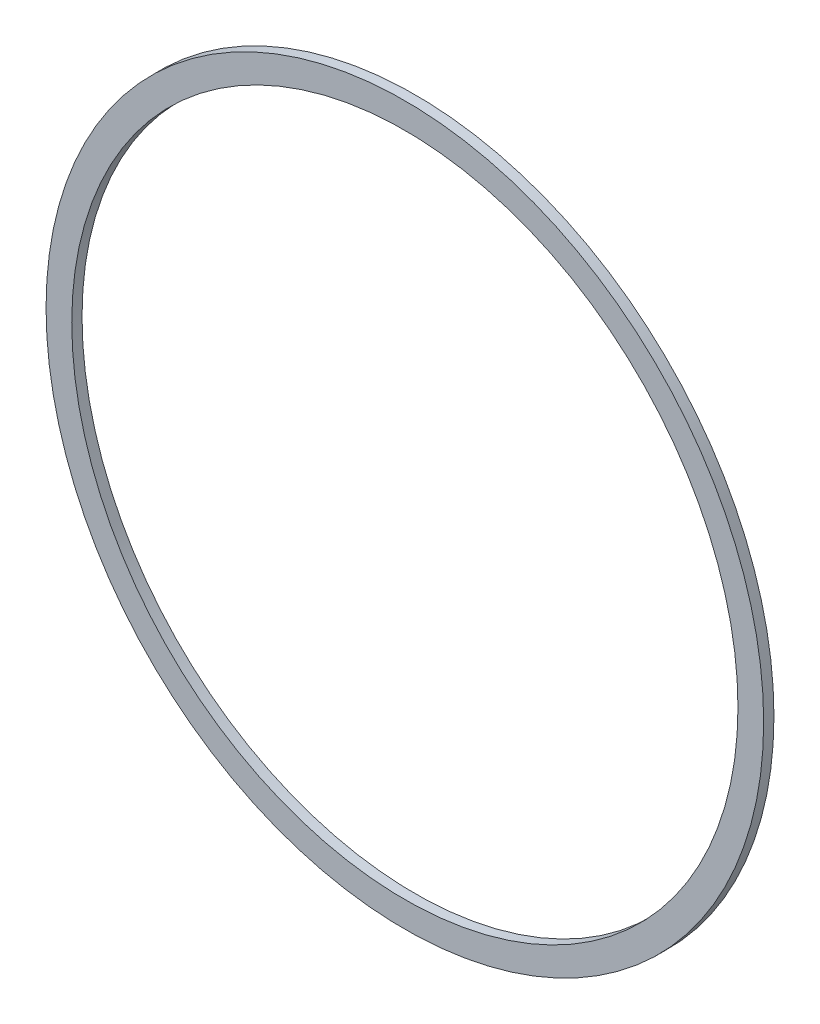
ISO-10303-21;
HEADER;
FILE_DESCRIPTION(('STEP AP214'),'2;1');
FILE_NAME('part.step','',(''),(''),'','','');
FILE_SCHEMA(('AUTOMOTIVE_DESIGN { 1 0 10303 214 1 1 1 1 }'));
ENDSEC;
DATA;
#1=APPLICATION_CONTEXT('core data for automotive mechanical design processes');
#2=APPLICATION_PROTOCOL_DEFINITION('international standard','automotive_design',2000,#1);
#3=PRODUCT_CONTEXT('',#1,'mechanical');
#4=PRODUCT('Part','Part','',(#3));
#5=PRODUCT_RELATED_PRODUCT_CATEGORY('part','',(#4));
#6=PRODUCT_DEFINITION_FORMATION('','',#4);
#7=PRODUCT_DEFINITION_CONTEXT('part definition',#1,'design');
#8=PRODUCT_DEFINITION('design','',#6,#7);
#9=PRODUCT_DEFINITION_SHAPE('','',#8);
#10=(LENGTH_UNIT() NAMED_UNIT(*) SI_UNIT(.MILLI.,.METRE.));
#11=(NAMED_UNIT(*) PLANE_ANGLE_UNIT() SI_UNIT($,.RADIAN.));
#12=(NAMED_UNIT(*) SI_UNIT($,.STERADIAN.) SOLID_ANGLE_UNIT());
#13=UNCERTAINTY_MEASURE_WITH_UNIT(LENGTH_MEASURE(1.E-05),#10,'distance_accuracy_value','');
#14=(GEOMETRIC_REPRESENTATION_CONTEXT(3) GLOBAL_UNCERTAINTY_ASSIGNED_CONTEXT((#13)) GLOBAL_UNIT_ASSIGNED_CONTEXT((#10,
#11,#12)) REPRESENTATION_CONTEXT('',''));
#15=CARTESIAN_POINT('',(0.,0.,0.));
#16=DIRECTION('',(0.,0.,1.));
#17=DIRECTION('',(1.,0.,0.));
#18=AXIS2_PLACEMENT_3D('',#15,#16,#17);
#19=CARTESIAN_POINT('',(0.,0.,2.));
#20=DIRECTION('',(0.,0.,1.));
#21=DIRECTION('',(1.,0.,0.));
#22=AXIS2_PLACEMENT_3D('',#19,#20,#21);
#23=PLANE('',#22);
#24=CARTESIAN_POINT('',(0.,0.,2.));
#25=DIRECTION('',(0.,0.,1.));
#26=DIRECTION('',(1.,0.,0.));
#27=AXIS2_PLACEMENT_3D('',#24,#25,#26);
#28=CIRCLE('',#27,69.8);
#29=CARTESIAN_POINT('',(69.8,0.,2.));
#30=VERTEX_POINT('',#29);
#31=EDGE_CURVE('E10',#30,#30,#28,.T.);
#32=ORIENTED_EDGE('',*,*,#31,.T.);
#33=EDGE_LOOP('',(#32));
#34=FACE_BOUND('',#33,.T.);
#35=CARTESIAN_POINT('',(0.,0.,2.));
#36=DIRECTION('',(0.,0.,1.));
#37=DIRECTION('',(1.,0.,0.));
#38=AXIS2_PLACEMENT_3D('',#35,#36,#37);
#39=CIRCLE('',#38,64.8);
#40=CARTESIAN_POINT('',(64.8,0.,2.));
#41=VERTEX_POINT('',#40);
#42=EDGE_CURVE('E54',#41,#41,#39,.T.);
#43=ORIENTED_EDGE('',*,*,#42,.F.);
#44=EDGE_LOOP('',(#43));
#45=FACE_BOUND('',#44,.T.);
#46=ADVANCED_FACE('F41',(#34,#45),#23,.T.);
#47=CARTESIAN_POINT('',(0.,0.,0.));
#48=DIRECTION('',(0.,0.,1.));
#49=DIRECTION('',(1.,0.,0.));
#50=AXIS2_PLACEMENT_3D('',#47,#48,#49);
#51=PLANE('',#50);
#52=CARTESIAN_POINT('',(0.,0.,0.));
#53=DIRECTION('',(0.,0.,1.));
#54=DIRECTION('',(1.,0.,0.));
#55=AXIS2_PLACEMENT_3D('',#52,#53,#54);
#56=CIRCLE('',#55,69.8);
#57=CARTESIAN_POINT('',(69.8,0.,0.));
#58=VERTEX_POINT('',#57);
#59=EDGE_CURVE('E45',#58,#58,#56,.T.);
#60=ORIENTED_EDGE('',*,*,#59,.F.);
#61=EDGE_LOOP('',(#60));
#62=FACE_BOUND('',#61,.T.);
#63=CARTESIAN_POINT('',(0.,0.,0.));
#64=DIRECTION('',(0.,0.,1.));
#65=DIRECTION('',(1.,0.,0.));
#66=AXIS2_PLACEMENT_3D('',#63,#64,#65);
#67=CIRCLE('',#66,64.8);
#68=CARTESIAN_POINT('',(64.8,0.,0.));
#69=VERTEX_POINT('',#68);
#70=EDGE_CURVE('E56',#69,#69,#67,.T.);
#71=ORIENTED_EDGE('',*,*,#70,.T.);
#72=EDGE_LOOP('',(#71));
#73=FACE_BOUND('',#72,.T.);
#74=ADVANCED_FACE('F68',(#62,#73),#51,.F.);
#75=CARTESIAN_POINT('',(0.,0.,2.));
#76=DIRECTION('',(0.,0.,-1.));
#77=DIRECTION('',(-1.,0.,0.));
#78=AXIS2_PLACEMENT_3D('',#75,#76,#77);
#79=CYLINDRICAL_SURFACE('',#78,69.8);
#80=ORIENTED_EDGE('',*,*,#31,.F.);
#81=EDGE_LOOP('',(#80));
#82=FACE_BOUND('',#81,.T.);
#83=ORIENTED_EDGE('',*,*,#59,.T.);
#84=EDGE_LOOP('',(#83));
#85=FACE_BOUND('',#84,.T.);
#86=ADVANCED_FACE('F43',(#82,#85),#79,.T.);
#87=CARTESIAN_POINT('',(0.,0.,2.));
#88=DIRECTION('',(0.,0.,-1.));
#89=DIRECTION('',(-1.,0.,0.));
#90=AXIS2_PLACEMENT_3D('',#87,#88,#89);
#91=CYLINDRICAL_SURFACE('',#90,64.8);
#92=ORIENTED_EDGE('',*,*,#42,.T.);
#93=EDGE_LOOP('',(#92));
#94=FACE_BOUND('',#93,.T.);
#95=ORIENTED_EDGE('',*,*,#70,.F.);
#96=EDGE_LOOP('',(#95));
#97=FACE_BOUND('',#96,.T.);
#98=ADVANCED_FACE('F64',(#94,#97),#91,.F.);
#99=CLOSED_SHELL('',(#46,#74,#86,#98));
#100=MANIFOLD_SOLID_BREP('B2',#99);
#101=ADVANCED_BREP_SHAPE_REPRESENTATION('',(#18,#100),#14);
#102=SHAPE_DEFINITION_REPRESENTATION(#9,#101);
ENDSEC;
END-ISO-10303-21;
